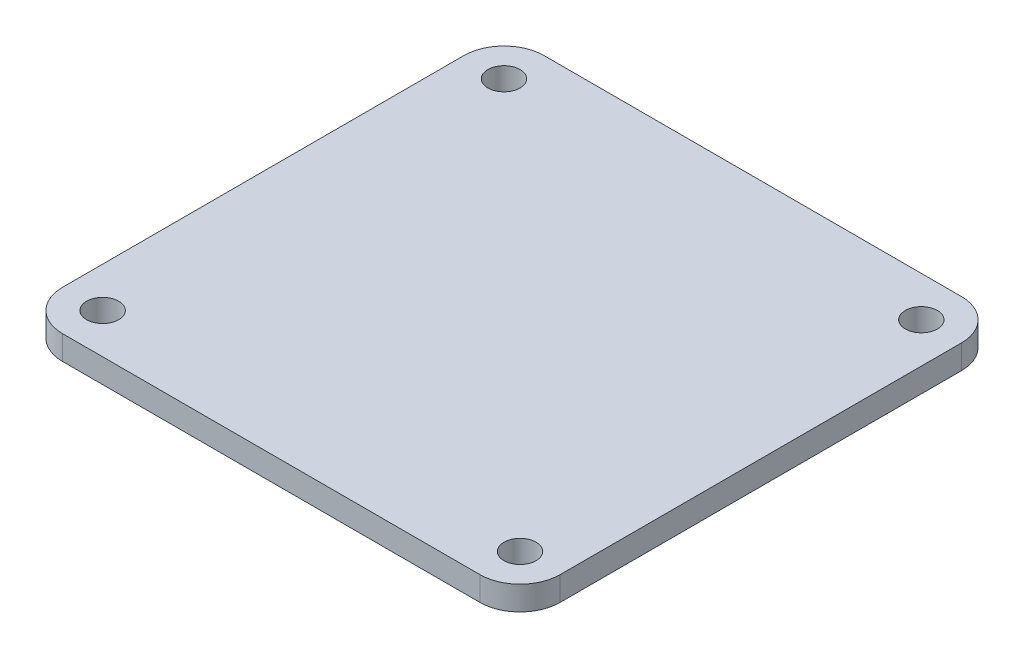
ISO-10303-21;
HEADER;
FILE_DESCRIPTION(('STEP AP214'),'2;1');
FILE_NAME('part.step','',(''),(''),'','','');
FILE_SCHEMA(('AUTOMOTIVE_DESIGN { 1 0 10303 214 1 1 1 1 }'));
ENDSEC;
DATA;
#1=APPLICATION_CONTEXT('core data for automotive mechanical design processes');
#2=APPLICATION_PROTOCOL_DEFINITION('international standard','automotive_design',2000,#1);
#3=PRODUCT_CONTEXT('',#1,'mechanical');
#4=PRODUCT('Part','Part','',(#3));
#5=PRODUCT_RELATED_PRODUCT_CATEGORY('part','',(#4));
#6=PRODUCT_DEFINITION_FORMATION('','',#4);
#7=PRODUCT_DEFINITION_CONTEXT('part definition',#1,'design');
#8=PRODUCT_DEFINITION('design','',#6,#7);
#9=PRODUCT_DEFINITION_SHAPE('','',#8);
#10=(LENGTH_UNIT() NAMED_UNIT(*) SI_UNIT(.MILLI.,.METRE.));
#11=(NAMED_UNIT(*) PLANE_ANGLE_UNIT() SI_UNIT($,.RADIAN.));
#12=(NAMED_UNIT(*) SI_UNIT($,.STERADIAN.) SOLID_ANGLE_UNIT());
#13=UNCERTAINTY_MEASURE_WITH_UNIT(LENGTH_MEASURE(1.E-05),#10,'distance_accuracy_value','');
#14=(GEOMETRIC_REPRESENTATION_CONTEXT(3) GLOBAL_UNCERTAINTY_ASSIGNED_CONTEXT((#13)) GLOBAL_UNIT_ASSIGNED_CONTEXT((#10,
#11,#12)) REPRESENTATION_CONTEXT('',''));
#15=CARTESIAN_POINT('',(0.,0.,0.));
#16=DIRECTION('',(0.,0.,1.));
#17=DIRECTION('',(1.,0.,0.));
#18=AXIS2_PLACEMENT_3D('',#15,#16,#17);
#19=CARTESIAN_POINT('',(31.,3.,30.));
#20=DIRECTION('',(-1.,0.,0.));
#21=DIRECTION('',(0.,0.,1.));
#22=AXIS2_PLACEMENT_3D('',#19,#20,#21);
#23=PLANE('',#22);
#24=DIRECTION('',(0.,0.,-1.));
#25=VECTOR('',#24,1.);
#26=CARTESIAN_POINT('',(31.,3.,30.));
#27=LINE('',#26,#25);
#28=CARTESIAN_POINT('',(31.,3.,25.));
#29=VERTEX_POINT('',#28);
#30=CARTESIAN_POINT('',(31.,3.,-25.));
#31=VERTEX_POINT('',#30);
#32=EDGE_CURVE('E119',#29,#31,#27,.T.);
#33=ORIENTED_EDGE('',*,*,#32,.F.);
#34=DIRECTION('',(0.,-1.,0.));
#35=VECTOR('',#34,1.);
#36=CARTESIAN_POINT('',(31.,3.,25.));
#37=LINE('',#36,#35);
#38=CARTESIAN_POINT('',(31.,0.,25.));
#39=VERTEX_POINT('',#38);
#40=EDGE_CURVE('E104',#29,#39,#37,.T.);
#41=ORIENTED_EDGE('',*,*,#40,.T.);
#42=DIRECTION('',(0.,0.,-1.));
#43=VECTOR('',#42,1.);
#44=CARTESIAN_POINT('',(31.,0.,30.));
#45=LINE('',#44,#43);
#46=CARTESIAN_POINT('',(31.,0.,-25.));
#47=VERTEX_POINT('',#46);
#48=EDGE_CURVE('E116',#39,#47,#45,.T.);
#49=ORIENTED_EDGE('',*,*,#48,.T.);
#50=DIRECTION('',(0.,-1.,0.));
#51=VECTOR('',#50,1.);
#52=CARTESIAN_POINT('',(31.,3.,-25.));
#53=LINE('',#52,#51);
#54=EDGE_CURVE('E121',#47,#31,#53,.F.);
#55=ORIENTED_EDGE('',*,*,#54,.T.);
#56=EDGE_LOOP('',(#33,#41,#49,#55));
#57=FACE_BOUND('',#56,.T.);
#58=ADVANCED_FACE('F33',(#57),#23,.F.);
#59=CARTESIAN_POINT('',(-31.,3.,-30.));
#60=DIRECTION('',(0.,0.,1.));
#61=DIRECTION('',(1.,0.,0.));
#62=AXIS2_PLACEMENT_3D('',#59,#60,#61);
#63=PLANE('',#62);
#64=DIRECTION('',(-1.,0.,0.));
#65=VECTOR('',#64,1.);
#66=CARTESIAN_POINT('',(-31.,3.,-30.));
#67=LINE('',#66,#65);
#68=CARTESIAN_POINT('',(26.,3.,-30.));
#69=VERTEX_POINT('',#68);
#70=CARTESIAN_POINT('',(-26.,3.,-30.));
#71=VERTEX_POINT('',#70);
#72=EDGE_CURVE('E163',#69,#71,#67,.T.);
#73=ORIENTED_EDGE('',*,*,#72,.F.);
#74=DIRECTION('',(0.,-1.,0.));
#75=VECTOR('',#74,1.);
#76=CARTESIAN_POINT('',(26.,3.,-30.));
#77=LINE('',#76,#75);
#78=CARTESIAN_POINT('',(26.,0.,-30.));
#79=VERTEX_POINT('',#78);
#80=EDGE_CURVE('E11',#69,#79,#77,.T.);
#81=ORIENTED_EDGE('',*,*,#80,.T.);
#82=DIRECTION('',(-1.,0.,0.));
#83=VECTOR('',#82,1.);
#84=CARTESIAN_POINT('',(-31.,0.,-30.));
#85=LINE('',#84,#83);
#86=CARTESIAN_POINT('',(-26.,0.,-30.));
#87=VERTEX_POINT('',#86);
#88=EDGE_CURVE('E126',#79,#87,#85,.T.);
#89=ORIENTED_EDGE('',*,*,#88,.T.);
#90=DIRECTION('',(0.,-1.,0.));
#91=VECTOR('',#90,1.);
#92=CARTESIAN_POINT('',(-26.,3.,-30.));
#93=LINE('',#92,#91);
#94=EDGE_CURVE('E41',#87,#71,#93,.F.);
#95=ORIENTED_EDGE('',*,*,#94,.T.);
#96=EDGE_LOOP('',(#73,#81,#89,#95));
#97=FACE_BOUND('',#96,.T.);
#98=ADVANCED_FACE('F162',(#97),#63,.F.);
#99=CARTESIAN_POINT('',(-31.,3.,30.));
#100=DIRECTION('',(1.,0.,0.));
#101=DIRECTION('',(0.,0.,-1.));
#102=AXIS2_PLACEMENT_3D('',#99,#100,#101);
#103=PLANE('',#102);
#104=DIRECTION('',(0.,0.,1.));
#105=VECTOR('',#104,1.);
#106=CARTESIAN_POINT('',(-31.,0.,30.));
#107=LINE('',#106,#105);
#108=CARTESIAN_POINT('',(-31.,0.,-25.));
#109=VERTEX_POINT('',#108);
#110=CARTESIAN_POINT('',(-31.,0.,25.));
#111=VERTEX_POINT('',#110);
#112=EDGE_CURVE('E130',#109,#111,#107,.T.);
#113=ORIENTED_EDGE('',*,*,#112,.T.);
#114=DIRECTION('',(0.,-1.,0.));
#115=VECTOR('',#114,1.);
#116=CARTESIAN_POINT('',(-31.,3.,25.));
#117=LINE('',#116,#115);
#118=CARTESIAN_POINT('',(-31.,3.,25.));
#119=VERTEX_POINT('',#118);
#120=EDGE_CURVE('E48',#111,#119,#117,.F.);
#121=ORIENTED_EDGE('',*,*,#120,.T.);
#122=DIRECTION('',(0.,0.,1.));
#123=VECTOR('',#122,1.);
#124=CARTESIAN_POINT('',(-31.,3.,30.));
#125=LINE('',#124,#123);
#126=CARTESIAN_POINT('',(-31.,3.,-25.));
#127=VERTEX_POINT('',#126);
#128=EDGE_CURVE('E169',#127,#119,#125,.T.);
#129=ORIENTED_EDGE('',*,*,#128,.F.);
#130=DIRECTION('',(0.,-1.,0.));
#131=VECTOR('',#130,1.);
#132=CARTESIAN_POINT('',(-31.,3.,-25.));
#133=LINE('',#132,#131);
#134=EDGE_CURVE('E156',#127,#109,#133,.T.);
#135=ORIENTED_EDGE('',*,*,#134,.T.);
#136=EDGE_LOOP('',(#113,#121,#129,#135));
#137=FACE_BOUND('',#136,.T.);
#138=ADVANCED_FACE('F173',(#137),#103,.F.);
#139=CARTESIAN_POINT('',(-31.,3.,30.));
#140=DIRECTION('',(0.,0.,-1.));
#141=DIRECTION('',(-1.,0.,0.));
#142=AXIS2_PLACEMENT_3D('',#139,#140,#141);
#143=PLANE('',#142);
#144=DIRECTION('',(1.,0.,0.));
#145=VECTOR('',#144,1.);
#146=CARTESIAN_POINT('',(-31.,0.,30.));
#147=LINE('',#146,#145);
#148=CARTESIAN_POINT('',(-26.,0.,30.));
#149=VERTEX_POINT('',#148);
#150=CARTESIAN_POINT('',(26.,0.,30.));
#151=VERTEX_POINT('',#150);
#152=EDGE_CURVE('E140',#149,#151,#147,.T.);
#153=ORIENTED_EDGE('',*,*,#152,.T.);
#154=DIRECTION('',(0.,-1.,0.));
#155=VECTOR('',#154,1.);
#156=CARTESIAN_POINT('',(26.,3.,30.));
#157=LINE('',#156,#155);
#158=CARTESIAN_POINT('',(26.,3.,30.));
#159=VERTEX_POINT('',#158);
#160=EDGE_CURVE('E105',#151,#159,#157,.F.);
#161=ORIENTED_EDGE('',*,*,#160,.T.);
#162=DIRECTION('',(1.,0.,0.));
#163=VECTOR('',#162,1.);
#164=CARTESIAN_POINT('',(-31.,3.,30.));
#165=LINE('',#164,#163);
#166=CARTESIAN_POINT('',(-26.,3.,30.));
#167=VERTEX_POINT('',#166);
#168=EDGE_CURVE('E136',#167,#159,#165,.T.);
#169=ORIENTED_EDGE('',*,*,#168,.F.);
#170=DIRECTION('',(0.,-1.,0.));
#171=VECTOR('',#170,1.);
#172=CARTESIAN_POINT('',(-26.,3.,30.));
#173=LINE('',#172,#171);
#174=EDGE_CURVE('E110',#167,#149,#173,.T.);
#175=ORIENTED_EDGE('',*,*,#174,.T.);
#176=EDGE_LOOP('',(#153,#161,#169,#175));
#177=FACE_BOUND('',#176,.T.);
#178=ADVANCED_FACE('F180',(#177),#143,.F.);
#179=CARTESIAN_POINT('',(0.,3.,0.));
#180=DIRECTION('',(0.,-1.,0.));
#181=DIRECTION('',(0.,0.,-1.));
#182=AXIS2_PLACEMENT_3D('',#179,#180,#181);
#183=PLANE('',#182);
#184=CARTESIAN_POINT('',(-26.,3.,-25.));
#185=DIRECTION('',(0.,1.,0.));
#186=DIRECTION('',(0.,0.,1.));
#187=AXIS2_PLACEMENT_3D('',#184,#185,#186);
#188=CIRCLE('',#187,1.99999999999999);
#189=CARTESIAN_POINT('',(-26.,3.,-23.));
#190=VERTEX_POINT('',#189);
#191=EDGE_CURVE('E200',#190,#190,#188,.T.);
#192=ORIENTED_EDGE('',*,*,#191,.F.);
#193=EDGE_LOOP('',(#192));
#194=FACE_BOUND('',#193,.T.);
#195=CARTESIAN_POINT('',(26.,3.,25.));
#196=DIRECTION('',(0.,1.,0.));
#197=DIRECTION('',(0.,0.,1.));
#198=AXIS2_PLACEMENT_3D('',#195,#196,#197);
#199=CIRCLE('',#198,1.99999999999999);
#200=CARTESIAN_POINT('',(26.,3.,27.));
#201=VERTEX_POINT('',#200);
#202=EDGE_CURVE('E194',#201,#201,#199,.T.);
#203=ORIENTED_EDGE('',*,*,#202,.F.);
#204=EDGE_LOOP('',(#203));
#205=FACE_BOUND('',#204,.T.);
#206=CARTESIAN_POINT('',(26.,3.,-25.));
#207=DIRECTION('',(0.,1.,0.));
#208=DIRECTION('',(0.,0.,1.));
#209=AXIS2_PLACEMENT_3D('',#206,#207,#208);
#210=CIRCLE('',#209,1.99999999999999);
#211=CARTESIAN_POINT('',(26.,3.,-23.));
#212=VERTEX_POINT('',#211);
#213=EDGE_CURVE('E188',#212,#212,#210,.T.);
#214=ORIENTED_EDGE('',*,*,#213,.F.);
#215=EDGE_LOOP('',(#214));
#216=FACE_BOUND('',#215,.T.);
#217=CARTESIAN_POINT('',(-26.,3.,25.));
#218=DIRECTION('',(0.,1.,0.));
#219=DIRECTION('',(0.,0.,1.));
#220=AXIS2_PLACEMENT_3D('',#217,#218,#219);
#221=CIRCLE('',#220,1.99999999999999);
#222=CARTESIAN_POINT('',(-26.,3.,27.));
#223=VERTEX_POINT('',#222);
#224=EDGE_CURVE('E133',#223,#223,#221,.T.);
#225=ORIENTED_EDGE('',*,*,#224,.F.);
#226=EDGE_LOOP('',(#225));
#227=FACE_BOUND('',#226,.T.);
#228=ORIENTED_EDGE('',*,*,#168,.T.);
#229=CARTESIAN_POINT('',(26.,3.,25.));
#230=DIRECTION('',(0.,-1.,0.));
#231=DIRECTION('',(0.,0.,-1.));
#232=AXIS2_PLACEMENT_3D('',#229,#230,#231);
#233=CIRCLE('',#232,5.);
#234=EDGE_CURVE('E154',#159,#29,#233,.F.);
#235=ORIENTED_EDGE('',*,*,#234,.T.);
#236=ORIENTED_EDGE('',*,*,#32,.T.);
#237=CARTESIAN_POINT('',(26.,3.,-25.));
#238=DIRECTION('',(0.,-1.,0.));
#239=DIRECTION('',(0.,0.,-1.));
#240=AXIS2_PLACEMENT_3D('',#237,#238,#239);
#241=CIRCLE('',#240,5.);
#242=EDGE_CURVE('E150',#31,#69,#241,.F.);
#243=ORIENTED_EDGE('',*,*,#242,.T.);
#244=ORIENTED_EDGE('',*,*,#72,.T.);
#245=CARTESIAN_POINT('',(-26.,3.,-25.));
#246=DIRECTION('',(0.,-1.,0.));
#247=DIRECTION('',(0.,0.,-1.));
#248=AXIS2_PLACEMENT_3D('',#245,#246,#247);
#249=CIRCLE('',#248,5.);
#250=EDGE_CURVE('E55',#71,#127,#249,.F.);
#251=ORIENTED_EDGE('',*,*,#250,.T.);
#252=ORIENTED_EDGE('',*,*,#128,.T.);
#253=CARTESIAN_POINT('',(-26.,3.,25.));
#254=DIRECTION('',(0.,-1.,0.));
#255=DIRECTION('',(0.,0.,-1.));
#256=AXIS2_PLACEMENT_3D('',#253,#254,#255);
#257=CIRCLE('',#256,5.);
#258=EDGE_CURVE('E152',#119,#167,#257,.F.);
#259=ORIENTED_EDGE('',*,*,#258,.T.);
#260=EDGE_LOOP('',(#228,#235,#236,#243,#244,#251,#252,#259));
#261=FACE_BOUND('',#260,.T.);
#262=ADVANCED_FACE('F167',(#194,#205,#216,#227,#261),#183,.F.);
#263=CARTESIAN_POINT('',(0.,0.,0.));
#264=DIRECTION('',(0.,-1.,0.));
#265=DIRECTION('',(0.,0.,-1.));
#266=AXIS2_PLACEMENT_3D('',#263,#264,#265);
#267=PLANE('',#266);
#268=CARTESIAN_POINT('',(-26.,0.,-25.));
#269=DIRECTION('',(0.,1.,0.));
#270=DIRECTION('',(0.,0.,1.));
#271=AXIS2_PLACEMENT_3D('',#268,#269,#270);
#272=CIRCLE('',#271,1.99999999999999);
#273=CARTESIAN_POINT('',(-26.,0.,-23.));
#274=VERTEX_POINT('',#273);
#275=EDGE_CURVE('E197',#274,#274,#272,.T.);
#276=ORIENTED_EDGE('',*,*,#275,.T.);
#277=EDGE_LOOP('',(#276));
#278=FACE_BOUND('',#277,.T.);
#279=CARTESIAN_POINT('',(26.,0.,25.));
#280=DIRECTION('',(0.,1.,0.));
#281=DIRECTION('',(0.,0.,1.));
#282=AXIS2_PLACEMENT_3D('',#279,#280,#281);
#283=CIRCLE('',#282,1.99999999999999);
#284=CARTESIAN_POINT('',(26.,0.,27.));
#285=VERTEX_POINT('',#284);
#286=EDGE_CURVE('E191',#285,#285,#283,.T.);
#287=ORIENTED_EDGE('',*,*,#286,.T.);
#288=EDGE_LOOP('',(#287));
#289=FACE_BOUND('',#288,.T.);
#290=CARTESIAN_POINT('',(26.,0.,-25.));
#291=DIRECTION('',(0.,1.,0.));
#292=DIRECTION('',(0.,0.,1.));
#293=AXIS2_PLACEMENT_3D('',#290,#291,#292);
#294=CIRCLE('',#293,1.99999999999999);
#295=CARTESIAN_POINT('',(26.,0.,-23.));
#296=VERTEX_POINT('',#295);
#297=EDGE_CURVE('E185',#296,#296,#294,.T.);
#298=ORIENTED_EDGE('',*,*,#297,.T.);
#299=EDGE_LOOP('',(#298));
#300=FACE_BOUND('',#299,.T.);
#301=CARTESIAN_POINT('',(-26.,0.,25.));
#302=DIRECTION('',(0.,1.,0.));
#303=DIRECTION('',(0.,0.,1.));
#304=AXIS2_PLACEMENT_3D('',#301,#302,#303);
#305=CIRCLE('',#304,1.99999999999999);
#306=CARTESIAN_POINT('',(-26.,0.,27.));
#307=VERTEX_POINT('',#306);
#308=EDGE_CURVE('E127',#307,#307,#305,.T.);
#309=ORIENTED_EDGE('',*,*,#308,.T.);
#310=EDGE_LOOP('',(#309));
#311=FACE_BOUND('',#310,.T.);
#312=ORIENTED_EDGE('',*,*,#48,.F.);
#313=CARTESIAN_POINT('',(26.,0.,25.));
#314=DIRECTION('',(0.,-1.,0.));
#315=DIRECTION('',(0.,0.,-1.));
#316=AXIS2_PLACEMENT_3D('',#313,#314,#315);
#317=CIRCLE('',#316,5.);
#318=EDGE_CURVE('E100',#39,#151,#317,.T.);
#319=ORIENTED_EDGE('',*,*,#318,.T.);
#320=ORIENTED_EDGE('',*,*,#152,.F.);
#321=CARTESIAN_POINT('',(-26.,0.,25.));
#322=DIRECTION('',(0.,-1.,0.));
#323=DIRECTION('',(0.,0.,-1.));
#324=AXIS2_PLACEMENT_3D('',#321,#322,#323);
#325=CIRCLE('',#324,5.);
#326=EDGE_CURVE('E111',#149,#111,#325,.T.);
#327=ORIENTED_EDGE('',*,*,#326,.T.);
#328=ORIENTED_EDGE('',*,*,#112,.F.);
#329=CARTESIAN_POINT('',(-26.,0.,-25.));
#330=DIRECTION('',(0.,-1.,0.));
#331=DIRECTION('',(0.,0.,-1.));
#332=AXIS2_PLACEMENT_3D('',#329,#330,#331);
#333=CIRCLE('',#332,5.);
#334=EDGE_CURVE('E120',#109,#87,#333,.T.);
#335=ORIENTED_EDGE('',*,*,#334,.T.);
#336=ORIENTED_EDGE('',*,*,#88,.F.);
#337=CARTESIAN_POINT('',(26.,0.,-25.));
#338=DIRECTION('',(0.,-1.,0.));
#339=DIRECTION('',(0.,0.,-1.));
#340=AXIS2_PLACEMENT_3D('',#337,#338,#339);
#341=CIRCLE('',#340,5.);
#342=EDGE_CURVE('E125',#79,#47,#341,.T.);
#343=ORIENTED_EDGE('',*,*,#342,.T.);
#344=EDGE_LOOP('',(#312,#319,#320,#327,#328,#335,#336,#343));
#345=FACE_BOUND('',#344,.T.);
#346=ADVANCED_FACE('F123',(#278,#289,#300,#311,#345),#267,.T.);
#347=CARTESIAN_POINT('',(-26.,3.,25.));
#348=DIRECTION('',(0.,1.,0.));
#349=DIRECTION('',(0.,0.,1.));
#350=AXIS2_PLACEMENT_3D('',#347,#348,#349);
#351=CYLINDRICAL_SURFACE('',#350,1.99999999999999);
#352=ORIENTED_EDGE('',*,*,#308,.F.);
#353=EDGE_LOOP('',(#352));
#354=FACE_BOUND('',#353,.T.);
#355=ORIENTED_EDGE('',*,*,#224,.T.);
#356=EDGE_LOOP('',(#355));
#357=FACE_BOUND('',#356,.T.);
#358=ADVANCED_FACE('F215',(#354,#357),#351,.F.);
#359=CARTESIAN_POINT('',(26.,3.,-25.));
#360=DIRECTION('',(0.,1.,0.));
#361=DIRECTION('',(0.,0.,1.));
#362=AXIS2_PLACEMENT_3D('',#359,#360,#361);
#363=CYLINDRICAL_SURFACE('',#362,1.99999999999999);
#364=ORIENTED_EDGE('',*,*,#297,.F.);
#365=EDGE_LOOP('',(#364));
#366=FACE_BOUND('',#365,.T.);
#367=ORIENTED_EDGE('',*,*,#213,.T.);
#368=EDGE_LOOP('',(#367));
#369=FACE_BOUND('',#368,.T.);
#370=ADVANCED_FACE('F217',(#366,#369),#363,.F.);
#371=CARTESIAN_POINT('',(26.,3.,25.));
#372=DIRECTION('',(0.,1.,0.));
#373=DIRECTION('',(0.,0.,1.));
#374=AXIS2_PLACEMENT_3D('',#371,#372,#373);
#375=CYLINDRICAL_SURFACE('',#374,1.99999999999999);
#376=ORIENTED_EDGE('',*,*,#286,.F.);
#377=EDGE_LOOP('',(#376));
#378=FACE_BOUND('',#377,.T.);
#379=ORIENTED_EDGE('',*,*,#202,.T.);
#380=EDGE_LOOP('',(#379));
#381=FACE_BOUND('',#380,.T.);
#382=ADVANCED_FACE('F224',(#378,#381),#375,.F.);
#383=CARTESIAN_POINT('',(-26.,3.,-25.));
#384=DIRECTION('',(0.,1.,0.));
#385=DIRECTION('',(0.,0.,1.));
#386=AXIS2_PLACEMENT_3D('',#383,#384,#385);
#387=CYLINDRICAL_SURFACE('',#386,1.99999999999999);
#388=ORIENTED_EDGE('',*,*,#275,.F.);
#389=EDGE_LOOP('',(#388));
#390=FACE_BOUND('',#389,.T.);
#391=ORIENTED_EDGE('',*,*,#191,.T.);
#392=EDGE_LOOP('',(#391));
#393=FACE_BOUND('',#392,.T.);
#394=ADVANCED_FACE('F204',(#390,#393),#387,.F.);
#395=CARTESIAN_POINT('',(26.,3.,25.));
#396=DIRECTION('',(0.,-1.,0.));
#397=DIRECTION('',(0.,0.,-1.));
#398=AXIS2_PLACEMENT_3D('',#395,#396,#397);
#399=CYLINDRICAL_SURFACE('',#398,5.);
#400=ORIENTED_EDGE('',*,*,#234,.F.);
#401=ORIENTED_EDGE('',*,*,#160,.F.);
#402=ORIENTED_EDGE('',*,*,#318,.F.);
#403=ORIENTED_EDGE('',*,*,#40,.F.);
#404=EDGE_LOOP('',(#400,#401,#402,#403));
#405=FACE_BOUND('',#404,.T.);
#406=ADVANCED_FACE('F103',(#405),#399,.T.);
#407=CARTESIAN_POINT('',(-26.,3.,25.));
#408=DIRECTION('',(0.,-1.,0.));
#409=DIRECTION('',(0.,0.,-1.));
#410=AXIS2_PLACEMENT_3D('',#407,#408,#409);
#411=CYLINDRICAL_SURFACE('',#410,5.);
#412=ORIENTED_EDGE('',*,*,#258,.F.);
#413=ORIENTED_EDGE('',*,*,#120,.F.);
#414=ORIENTED_EDGE('',*,*,#326,.F.);
#415=ORIENTED_EDGE('',*,*,#174,.F.);
#416=EDGE_LOOP('',(#412,#413,#414,#415));
#417=FACE_BOUND('',#416,.T.);
#418=ADVANCED_FACE('F177',(#417),#411,.T.);
#419=CARTESIAN_POINT('',(26.,3.,-25.));
#420=DIRECTION('',(0.,-1.,0.));
#421=DIRECTION('',(0.,0.,-1.));
#422=AXIS2_PLACEMENT_3D('',#419,#420,#421);
#423=CYLINDRICAL_SURFACE('',#422,5.);
#424=ORIENTED_EDGE('',*,*,#242,.F.);
#425=ORIENTED_EDGE('',*,*,#54,.F.);
#426=ORIENTED_EDGE('',*,*,#342,.F.);
#427=ORIENTED_EDGE('',*,*,#80,.F.);
#428=EDGE_LOOP('',(#424,#425,#426,#427));
#429=FACE_BOUND('',#428,.T.);
#430=ADVANCED_FACE('F241',(#429),#423,.T.);
#431=CARTESIAN_POINT('',(-26.,3.,-25.));
#432=DIRECTION('',(0.,-1.,0.));
#433=DIRECTION('',(0.,0.,-1.));
#434=AXIS2_PLACEMENT_3D('',#431,#432,#433);
#435=CYLINDRICAL_SURFACE('',#434,5.);
#436=ORIENTED_EDGE('',*,*,#250,.F.);
#437=ORIENTED_EDGE('',*,*,#94,.F.);
#438=ORIENTED_EDGE('',*,*,#334,.F.);
#439=ORIENTED_EDGE('',*,*,#134,.F.);
#440=EDGE_LOOP('',(#436,#437,#438,#439));
#441=FACE_BOUND('',#440,.T.);
#442=ADVANCED_FACE('F35',(#441),#435,.T.);
#443=CLOSED_SHELL('',(#58,#98,#138,#178,#262,#346,#358,#370,#382,#394,#406,#418,#430,#442));
#444=MANIFOLD_SOLID_BREP('B2',#443);
#445=ADVANCED_BREP_SHAPE_REPRESENTATION('',(#18,#444),#14);
#446=SHAPE_DEFINITION_REPRESENTATION(#9,#445);
ENDSEC;
END-ISO-10303-21;
